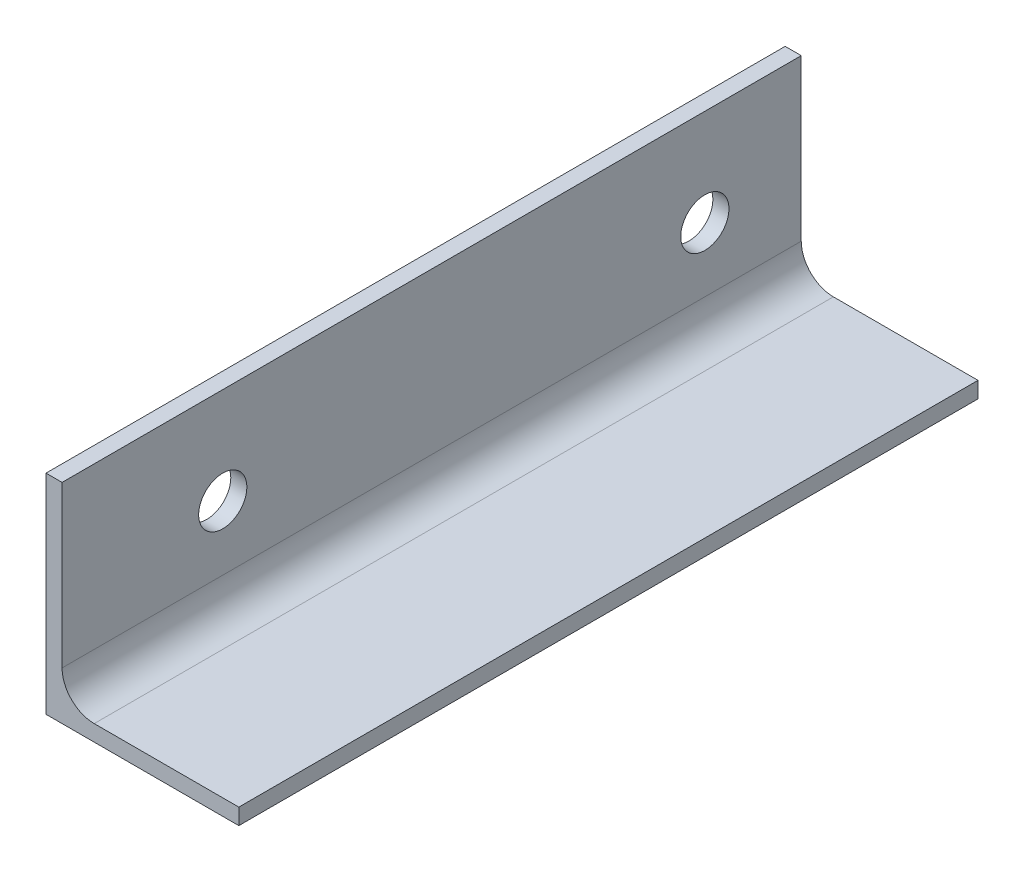
ISO-10303-21;
HEADER;
FILE_DESCRIPTION(('STEP AP214'),'2;1');
FILE_NAME('part.step','',(''),(''),'','','');
FILE_SCHEMA(('AUTOMOTIVE_DESIGN { 1 0 10303 214 1 1 1 1 }'));
ENDSEC;
DATA;
#1=APPLICATION_CONTEXT('core data for automotive mechanical design processes');
#2=APPLICATION_PROTOCOL_DEFINITION('international standard','automotive_design',2000,#1);
#3=PRODUCT_CONTEXT('',#1,'mechanical');
#4=PRODUCT('Part','Part','',(#3));
#5=PRODUCT_RELATED_PRODUCT_CATEGORY('part','',(#4));
#6=PRODUCT_DEFINITION_FORMATION('','',#4);
#7=PRODUCT_DEFINITION_CONTEXT('part definition',#1,'design');
#8=PRODUCT_DEFINITION('design','',#6,#7);
#9=PRODUCT_DEFINITION_SHAPE('','',#8);
#10=(LENGTH_UNIT() NAMED_UNIT(*) SI_UNIT(.MILLI.,.METRE.));
#11=(NAMED_UNIT(*) PLANE_ANGLE_UNIT() SI_UNIT($,.RADIAN.));
#12=(NAMED_UNIT(*) SI_UNIT($,.STERADIAN.) SOLID_ANGLE_UNIT());
#13=UNCERTAINTY_MEASURE_WITH_UNIT(LENGTH_MEASURE(1.E-05),#10,'distance_accuracy_value','');
#14=(GEOMETRIC_REPRESENTATION_CONTEXT(3) GLOBAL_UNCERTAINTY_ASSIGNED_CONTEXT((#13)) GLOBAL_UNIT_ASSIGNED_CONTEXT((#10,
#11,#12)) REPRESENTATION_CONTEXT('',''));
#15=CARTESIAN_POINT('',(0.,0.,0.));
#16=DIRECTION('',(0.,0.,1.));
#17=DIRECTION('',(1.,0.,0.));
#18=AXIS2_PLACEMENT_3D('',#15,#16,#17);
#19=CARTESIAN_POINT('',(-2.5,-30.,230.));
#20=DIRECTION('',(1.,0.,0.));
#21=DIRECTION('',(0.,0.,-1.));
#22=AXIS2_PLACEMENT_3D('',#19,#20,#21);
#23=PLANE('',#22);
#24=CARTESIAN_POINT('',(-2.5,0.,30.));
#25=DIRECTION('',(1.,0.,0.));
#26=DIRECTION('',(0.,0.,-1.));
#27=AXIS2_PLACEMENT_3D('',#24,#25,#26);
#28=CIRCLE('',#27,7.5);
#29=CARTESIAN_POINT('',(-2.5,0.,22.5));
#30=VERTEX_POINT('',#29);
#31=EDGE_CURVE('E131',#30,#30,#28,.F.);
#32=ORIENTED_EDGE('',*,*,#31,.F.);
#33=EDGE_LOOP('',(#32));
#34=FACE_BOUND('',#33,.T.);
#35=CARTESIAN_POINT('',(-2.5,0.,180.));
#36=DIRECTION('',(1.,0.,0.));
#37=DIRECTION('',(0.,0.,-1.));
#38=AXIS2_PLACEMENT_3D('',#35,#36,#37);
#39=CIRCLE('',#38,7.50000000000001);
#40=CARTESIAN_POINT('',(-2.5,0.,172.5));
#41=VERTEX_POINT('',#40);
#42=EDGE_CURVE('E170',#41,#41,#39,.F.);
#43=ORIENTED_EDGE('',*,*,#42,.F.);
#44=EDGE_LOOP('',(#43));
#45=FACE_BOUND('',#44,.T.);
#46=DIRECTION('',(0.,-1.,0.));
#47=VECTOR('',#46,1.);
#48=CARTESIAN_POINT('',(-2.5,-30.,0.));
#49=LINE('',#48,#47);
#50=CARTESIAN_POINT('',(-2.5,30.,0.));
#51=VERTEX_POINT('',#50);
#52=CARTESIAN_POINT('',(-2.5,-35.,0.));
#53=VERTEX_POINT('',#52);
#54=EDGE_CURVE('E88',#51,#53,#49,.T.);
#55=ORIENTED_EDGE('',*,*,#54,.T.);
#56=DIRECTION('',(0.,0.,-1.));
#57=VECTOR('',#56,1.);
#58=CARTESIAN_POINT('',(-2.5,-35.,230.));
#59=LINE('',#58,#57);
#60=CARTESIAN_POINT('',(-2.5,-35.,230.));
#61=VERTEX_POINT('',#60);
#62=EDGE_CURVE('E11',#61,#53,#59,.T.);
#63=ORIENTED_EDGE('',*,*,#62,.F.);
#64=DIRECTION('',(0.,-1.,0.));
#65=VECTOR('',#64,1.);
#66=CARTESIAN_POINT('',(-2.5,-30.,230.));
#67=LINE('',#66,#65);
#68=CARTESIAN_POINT('',(-2.5,30.,230.));
#69=VERTEX_POINT('',#68);
#70=EDGE_CURVE('E94',#69,#61,#67,.T.);
#71=ORIENTED_EDGE('',*,*,#70,.F.);
#72=DIRECTION('',(0.,0.,-1.));
#73=VECTOR('',#72,1.);
#74=CARTESIAN_POINT('',(-2.5,30.,230.));
#75=LINE('',#74,#73);
#76=EDGE_CURVE('E125',#69,#51,#75,.T.);
#77=ORIENTED_EDGE('',*,*,#76,.T.);
#78=EDGE_LOOP('',(#55,#63,#71,#77));
#79=FACE_BOUND('',#78,.T.);
#80=ADVANCED_FACE('F39',(#34,#45,#79),#23,.F.);
#81=CARTESIAN_POINT('',(-2.5,-35.,230.));
#82=DIRECTION('',(0.,1.,0.));
#83=DIRECTION('',(-1.,0.,0.));
#84=AXIS2_PLACEMENT_3D('',#81,#82,#83);
#85=PLANE('',#84);
#86=DIRECTION('',(1.,0.,0.));
#87=VECTOR('',#86,1.);
#88=CARTESIAN_POINT('',(-2.5,-35.,0.));
#89=LINE('',#88,#87);
#90=CARTESIAN_POINT('',(57.5,-35.,0.));
#91=VERTEX_POINT('',#90);
#92=EDGE_CURVE('E130',#53,#91,#89,.T.);
#93=ORIENTED_EDGE('',*,*,#92,.T.);
#94=DIRECTION('',(0.,0.,-1.));
#95=VECTOR('',#94,1.);
#96=CARTESIAN_POINT('',(57.5,-35.,230.));
#97=LINE('',#96,#95);
#98=CARTESIAN_POINT('',(57.5,-35.,230.));
#99=VERTEX_POINT('',#98);
#100=EDGE_CURVE('E47',#99,#91,#97,.T.);
#101=ORIENTED_EDGE('',*,*,#100,.F.);
#102=DIRECTION('',(1.,0.,0.));
#103=VECTOR('',#102,1.);
#104=CARTESIAN_POINT('',(-2.5,-35.,230.));
#105=LINE('',#104,#103);
#106=EDGE_CURVE('E161',#61,#99,#105,.T.);
#107=ORIENTED_EDGE('',*,*,#106,.F.);
#108=ORIENTED_EDGE('',*,*,#62,.T.);
#109=EDGE_LOOP('',(#93,#101,#107,#108));
#110=FACE_BOUND('',#109,.T.);
#111=ADVANCED_FACE('F195',(#110),#85,.F.);
#112=CARTESIAN_POINT('',(57.5,-30.,230.));
#113=DIRECTION('',(-1.,0.,0.));
#114=DIRECTION('',(0.,-1.,0.));
#115=AXIS2_PLACEMENT_3D('',#112,#113,#114);
#116=PLANE('',#115);
#117=DIRECTION('',(0.,1.,0.));
#118=VECTOR('',#117,1.);
#119=CARTESIAN_POINT('',(57.5,-30.,0.));
#120=LINE('',#119,#118);
#121=CARTESIAN_POINT('',(57.5,-30.,0.));
#122=VERTEX_POINT('',#121);
#123=EDGE_CURVE('E133',#91,#122,#120,.T.);
#124=ORIENTED_EDGE('',*,*,#123,.T.);
#125=DIRECTION('',(0.,0.,-1.));
#126=VECTOR('',#125,1.);
#127=CARTESIAN_POINT('',(57.5,-30.,230.));
#128=LINE('',#127,#126);
#129=CARTESIAN_POINT('',(57.5,-30.,230.));
#130=VERTEX_POINT('',#129);
#131=EDGE_CURVE('E145',#130,#122,#128,.T.);
#132=ORIENTED_EDGE('',*,*,#131,.F.);
#133=DIRECTION('',(0.,1.,0.));
#134=VECTOR('',#133,1.);
#135=CARTESIAN_POINT('',(57.5,-30.,230.));
#136=LINE('',#135,#134);
#137=EDGE_CURVE('E154',#99,#130,#136,.T.);
#138=ORIENTED_EDGE('',*,*,#137,.F.);
#139=ORIENTED_EDGE('',*,*,#100,.T.);
#140=EDGE_LOOP('',(#124,#132,#138,#139));
#141=FACE_BOUND('',#140,.T.);
#142=ADVANCED_FACE('F152',(#141),#116,.F.);
#143=CARTESIAN_POINT('',(12.5000000000001,-30.,230.));
#144=DIRECTION('',(0.,-1.,0.));
#145=DIRECTION('',(0.,0.,-1.));
#146=AXIS2_PLACEMENT_3D('',#143,#144,#145);
#147=PLANE('',#146);
#148=DIRECTION('',(-1.,0.,0.));
#149=VECTOR('',#148,1.);
#150=CARTESIAN_POINT('',(12.5000000000001,-30.,0.));
#151=LINE('',#150,#149);
#152=CARTESIAN_POINT('',(12.5000000000001,-30.,0.));
#153=VERTEX_POINT('',#152);
#154=EDGE_CURVE('E135',#122,#153,#151,.T.);
#155=ORIENTED_EDGE('',*,*,#154,.T.);
#156=DIRECTION('',(0.,0.,-1.));
#157=VECTOR('',#156,1.);
#158=CARTESIAN_POINT('',(12.5000000000001,-30.,230.));
#159=LINE('',#158,#157);
#160=CARTESIAN_POINT('',(12.5000000000001,-30.,230.));
#161=VERTEX_POINT('',#160);
#162=EDGE_CURVE('E120',#161,#153,#159,.T.);
#163=ORIENTED_EDGE('',*,*,#162,.F.);
#164=DIRECTION('',(-1.,0.,0.));
#165=VECTOR('',#164,1.);
#166=CARTESIAN_POINT('',(12.5000000000001,-30.,230.));
#167=LINE('',#166,#165);
#168=EDGE_CURVE('E111',#130,#161,#167,.T.);
#169=ORIENTED_EDGE('',*,*,#168,.F.);
#170=ORIENTED_EDGE('',*,*,#131,.T.);
#171=EDGE_LOOP('',(#155,#163,#169,#170));
#172=FACE_BOUND('',#171,.T.);
#173=ADVANCED_FACE('F160',(#172),#147,.F.);
#174=CARTESIAN_POINT('',(12.5,-20.,230.));
#175=DIRECTION('',(0.,0.,-1.));
#176=DIRECTION('',(-1.,0.,0.));
#177=AXIS2_PLACEMENT_3D('',#174,#175,#176);
#178=CYLINDRICAL_SURFACE('',#177,10.);
#179=CARTESIAN_POINT('',(12.5,-20.,0.));
#180=DIRECTION('',(0.,0.,-1.));
#181=DIRECTION('',(-1.,0.,0.));
#182=AXIS2_PLACEMENT_3D('',#179,#180,#181);
#183=CIRCLE('',#182,10.);
#184=CARTESIAN_POINT('',(2.5,-19.9999999999999,0.));
#185=VERTEX_POINT('',#184);
#186=EDGE_CURVE('E119',#153,#185,#183,.T.);
#187=ORIENTED_EDGE('',*,*,#186,.T.);
#188=DIRECTION('',(0.,0.,-1.));
#189=VECTOR('',#188,1.);
#190=CARTESIAN_POINT('',(2.5,-19.9999999999999,230.));
#191=LINE('',#190,#189);
#192=CARTESIAN_POINT('',(2.5,-19.9999999999999,230.));
#193=VERTEX_POINT('',#192);
#194=EDGE_CURVE('E116',#193,#185,#191,.T.);
#195=ORIENTED_EDGE('',*,*,#194,.F.);
#196=CARTESIAN_POINT('',(12.5,-20.,230.));
#197=DIRECTION('',(0.,0.,-1.));
#198=DIRECTION('',(-1.,0.,0.));
#199=AXIS2_PLACEMENT_3D('',#196,#197,#198);
#200=CIRCLE('',#199,10.);
#201=EDGE_CURVE('E105',#161,#193,#200,.T.);
#202=ORIENTED_EDGE('',*,*,#201,.F.);
#203=ORIENTED_EDGE('',*,*,#162,.T.);
#204=EDGE_LOOP('',(#187,#195,#202,#203));
#205=FACE_BOUND('',#204,.T.);
#206=ADVANCED_FACE('F117',(#205),#178,.F.);
#207=CARTESIAN_POINT('',(2.5,-19.9999999999999,230.));
#208=DIRECTION('',(-1.,0.,0.));
#209=DIRECTION('',(0.,0.,1.));
#210=AXIS2_PLACEMENT_3D('',#207,#208,#209);
#211=PLANE('',#210);
#212=CARTESIAN_POINT('',(2.5,0.,30.));
#213=DIRECTION('',(1.,0.,0.));
#214=DIRECTION('',(0.,0.,-1.));
#215=AXIS2_PLACEMENT_3D('',#212,#213,#214);
#216=CIRCLE('',#215,7.5);
#217=CARTESIAN_POINT('',(2.5,0.,22.5));
#218=VERTEX_POINT('',#217);
#219=EDGE_CURVE('E169',#218,#218,#216,.T.);
#220=ORIENTED_EDGE('',*,*,#219,.F.);
#221=EDGE_LOOP('',(#220));
#222=FACE_BOUND('',#221,.T.);
#223=CARTESIAN_POINT('',(2.5,0.,180.));
#224=DIRECTION('',(1.,0.,0.));
#225=DIRECTION('',(0.,0.,-1.));
#226=AXIS2_PLACEMENT_3D('',#223,#224,#225);
#227=CIRCLE('',#226,7.50000000000001);
#228=CARTESIAN_POINT('',(2.5,0.,172.5));
#229=VERTEX_POINT('',#228);
#230=EDGE_CURVE('E166',#229,#229,#227,.T.);
#231=ORIENTED_EDGE('',*,*,#230,.F.);
#232=EDGE_LOOP('',(#231));
#233=FACE_BOUND('',#232,.T.);
#234=DIRECTION('',(0.,1.,0.));
#235=VECTOR('',#234,1.);
#236=CARTESIAN_POINT('',(2.5,-19.9999999999999,0.));
#237=LINE('',#236,#235);
#238=CARTESIAN_POINT('',(2.5,30.,0.));
#239=VERTEX_POINT('',#238);
#240=EDGE_CURVE('E81',#185,#239,#237,.T.);
#241=ORIENTED_EDGE('',*,*,#240,.T.);
#242=DIRECTION('',(0.,0.,-1.));
#243=VECTOR('',#242,1.);
#244=CARTESIAN_POINT('',(2.5,30.,230.));
#245=LINE('',#244,#243);
#246=CARTESIAN_POINT('',(2.5,30.,230.));
#247=VERTEX_POINT('',#246);
#248=EDGE_CURVE('E121',#247,#239,#245,.T.);
#249=ORIENTED_EDGE('',*,*,#248,.F.);
#250=DIRECTION('',(0.,1.,0.));
#251=VECTOR('',#250,1.);
#252=CARTESIAN_POINT('',(2.5,-19.9999999999999,230.));
#253=LINE('',#252,#251);
#254=EDGE_CURVE('E109',#193,#247,#253,.T.);
#255=ORIENTED_EDGE('',*,*,#254,.F.);
#256=ORIENTED_EDGE('',*,*,#194,.T.);
#257=EDGE_LOOP('',(#241,#249,#255,#256));
#258=FACE_BOUND('',#257,.T.);
#259=ADVANCED_FACE('F123',(#222,#233,#258),#211,.F.);
#260=CARTESIAN_POINT('',(2.5,30.,230.));
#261=DIRECTION('',(0.,-1.,0.));
#262=DIRECTION('',(0.,0.,-1.));
#263=AXIS2_PLACEMENT_3D('',#260,#261,#262);
#264=PLANE('',#263);
#265=DIRECTION('',(-1.,0.,0.));
#266=VECTOR('',#265,1.);
#267=CARTESIAN_POINT('',(2.5,30.,0.));
#268=LINE('',#267,#266);
#269=EDGE_CURVE('E139',#239,#51,#268,.T.);
#270=ORIENTED_EDGE('',*,*,#269,.T.);
#271=ORIENTED_EDGE('',*,*,#76,.F.);
#272=DIRECTION('',(-1.,0.,0.));
#273=VECTOR('',#272,1.);
#274=CARTESIAN_POINT('',(2.5,30.,230.));
#275=LINE('',#274,#273);
#276=EDGE_CURVE('E55',#247,#69,#275,.T.);
#277=ORIENTED_EDGE('',*,*,#276,.F.);
#278=ORIENTED_EDGE('',*,*,#248,.T.);
#279=EDGE_LOOP('',(#270,#271,#277,#278));
#280=FACE_BOUND('',#279,.T.);
#281=ADVANCED_FACE('F183',(#280),#264,.F.);
#282=CARTESIAN_POINT('',(12.5,-20.,230.));
#283=DIRECTION('',(0.,0.,-1.));
#284=DIRECTION('',(-1.,0.,0.));
#285=AXIS2_PLACEMENT_3D('',#282,#283,#284);
#286=PLANE('',#285);
#287=ORIENTED_EDGE('',*,*,#70,.T.);
#288=ORIENTED_EDGE('',*,*,#106,.T.);
#289=ORIENTED_EDGE('',*,*,#137,.T.);
#290=ORIENTED_EDGE('',*,*,#168,.T.);
#291=ORIENTED_EDGE('',*,*,#201,.T.);
#292=ORIENTED_EDGE('',*,*,#254,.T.);
#293=ORIENTED_EDGE('',*,*,#276,.T.);
#294=EDGE_LOOP('',(#287,#288,#289,#290,#291,#292,#293));
#295=FACE_BOUND('',#294,.T.);
#296=ADVANCED_FACE('F107',(#295),#286,.F.);
#297=CARTESIAN_POINT('',(12.5,-20.,0.));
#298=DIRECTION('',(0.,0.,-1.));
#299=DIRECTION('',(-1.,0.,0.));
#300=AXIS2_PLACEMENT_3D('',#297,#298,#299);
#301=PLANE('',#300);
#302=ORIENTED_EDGE('',*,*,#54,.F.);
#303=ORIENTED_EDGE('',*,*,#269,.F.);
#304=ORIENTED_EDGE('',*,*,#240,.F.);
#305=ORIENTED_EDGE('',*,*,#186,.F.);
#306=ORIENTED_EDGE('',*,*,#154,.F.);
#307=ORIENTED_EDGE('',*,*,#123,.F.);
#308=ORIENTED_EDGE('',*,*,#92,.F.);
#309=EDGE_LOOP('',(#302,#303,#304,#305,#306,#307,#308));
#310=FACE_BOUND('',#309,.T.);
#311=ADVANCED_FACE('F158',(#310),#301,.T.);
#312=CARTESIAN_POINT('',(-2.501,0.,180.));
#313=DIRECTION('',(1.,0.,0.));
#314=DIRECTION('',(0.,0.,-1.));
#315=AXIS2_PLACEMENT_3D('',#312,#313,#314);
#316=CYLINDRICAL_SURFACE('',#315,7.50000000000001);
#317=ORIENTED_EDGE('',*,*,#230,.T.);
#318=EDGE_LOOP('',(#317));
#319=FACE_BOUND('',#318,.T.);
#320=ORIENTED_EDGE('',*,*,#42,.T.);
#321=EDGE_LOOP('',(#320));
#322=FACE_BOUND('',#321,.T.);
#323=ADVANCED_FACE('F187',(#319,#322),#316,.F.);
#324=CARTESIAN_POINT('',(-2.501,0.,30.));
#325=DIRECTION('',(1.,0.,0.));
#326=DIRECTION('',(0.,0.,-1.));
#327=AXIS2_PLACEMENT_3D('',#324,#325,#326);
#328=CYLINDRICAL_SURFACE('',#327,7.5);
#329=ORIENTED_EDGE('',*,*,#219,.T.);
#330=EDGE_LOOP('',(#329));
#331=FACE_BOUND('',#330,.T.);
#332=ORIENTED_EDGE('',*,*,#31,.T.);
#333=EDGE_LOOP('',(#332));
#334=FACE_BOUND('',#333,.T.);
#335=ADVANCED_FACE('F178',(#331,#334),#328,.F.);
#336=CLOSED_SHELL('',(#80,#111,#142,#173,#206,#259,#281,#296,#311,#323,#335));
#337=MANIFOLD_SOLID_BREP('B2',#336);
#338=ADVANCED_BREP_SHAPE_REPRESENTATION('',(#18,#337),#14);
#339=SHAPE_DEFINITION_REPRESENTATION(#9,#338);
ENDSEC;
END-ISO-10303-21;
